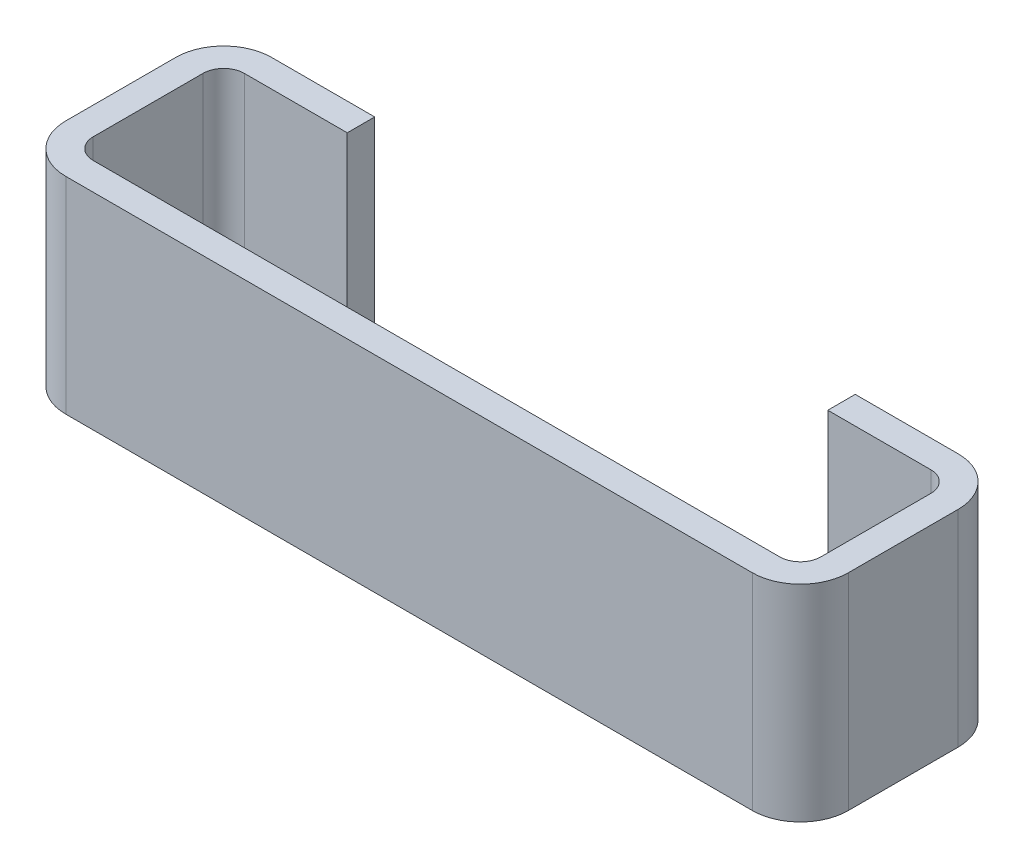
ISO-10303-21;
HEADER;
FILE_DESCRIPTION(('STEP AP214'),'2;1');
FILE_NAME('part.step','',(''),(''),'','','');
FILE_SCHEMA(('AUTOMOTIVE_DESIGN { 1 0 10303 214 1 1 1 1 }'));
ENDSEC;
DATA;
#1=APPLICATION_CONTEXT('core data for automotive mechanical design processes');
#2=APPLICATION_PROTOCOL_DEFINITION('international standard','automotive_design',2000,#1);
#3=PRODUCT_CONTEXT('',#1,'mechanical');
#4=PRODUCT('Part','Part','',(#3));
#5=PRODUCT_RELATED_PRODUCT_CATEGORY('part','',(#4));
#6=PRODUCT_DEFINITION_FORMATION('','',#4);
#7=PRODUCT_DEFINITION_CONTEXT('part definition',#1,'design');
#8=PRODUCT_DEFINITION('design','',#6,#7);
#9=PRODUCT_DEFINITION_SHAPE('','',#8);
#10=(LENGTH_UNIT() NAMED_UNIT(*) SI_UNIT(.MILLI.,.METRE.));
#11=(NAMED_UNIT(*) PLANE_ANGLE_UNIT() SI_UNIT($,.RADIAN.));
#12=(NAMED_UNIT(*) SI_UNIT($,.STERADIAN.) SOLID_ANGLE_UNIT());
#13=UNCERTAINTY_MEASURE_WITH_UNIT(LENGTH_MEASURE(1.E-05),#10,'distance_accuracy_value','');
#14=(GEOMETRIC_REPRESENTATION_CONTEXT(3) GLOBAL_UNCERTAINTY_ASSIGNED_CONTEXT((#13)) GLOBAL_UNIT_ASSIGNED_CONTEXT((#10,
#11,#12)) REPRESENTATION_CONTEXT('',''));
#15=CARTESIAN_POINT('',(0.,0.,0.));
#16=DIRECTION('',(0.,0.,1.));
#17=DIRECTION('',(1.,0.,0.));
#18=AXIS2_PLACEMENT_3D('',#15,#16,#17);
#19=CARTESIAN_POINT('',(1.75,-0.751,0.201));
#20=DIRECTION('',(-1.,0.,0.));
#21=DIRECTION('',(0.,1.,0.));
#22=AXIS2_PLACEMENT_3D('',#19,#20,#21);
#23=PLANE('',#22);
#24=DIRECTION('',(0.,1.,0.));
#25=VECTOR('',#24,1.);
#26=CARTESIAN_POINT('',(1.75,0.,0.));
#27=LINE('',#26,#25);
#28=CARTESIAN_POINT('',(1.75,-0.75,0.));
#29=VERTEX_POINT('',#28);
#30=CARTESIAN_POINT('',(1.75,0.75,0.));
#31=VERTEX_POINT('',#30);
#32=EDGE_CURVE('E162',#29,#31,#27,.T.);
#33=ORIENTED_EDGE('',*,*,#32,.F.);
#34=DIRECTION('',(0.,0.,1.));
#35=VECTOR('',#34,1.);
#36=CARTESIAN_POINT('',(1.75,-0.75,0.0999999999999995));
#37=LINE('',#36,#35);
#38=CARTESIAN_POINT('',(1.75,-0.75,0.2));
#39=VERTEX_POINT('',#38);
#40=EDGE_CURVE('E154',#29,#39,#37,.T.);
#41=ORIENTED_EDGE('',*,*,#40,.T.);
#42=DIRECTION('',(0.,-1.,0.));
#43=VECTOR('',#42,1.);
#44=CARTESIAN_POINT('',(1.75,0.,0.2));
#45=LINE('',#44,#43);
#46=CARTESIAN_POINT('',(1.75,0.75,0.2));
#47=VERTEX_POINT('',#46);
#48=EDGE_CURVE('E178',#47,#39,#45,.T.);
#49=ORIENTED_EDGE('',*,*,#48,.F.);
#50=DIRECTION('',(0.,0.,-1.));
#51=VECTOR('',#50,1.);
#52=CARTESIAN_POINT('',(1.75,0.75,0.0999999999999995));
#53=LINE('',#52,#51);
#54=EDGE_CURVE('E140',#47,#31,#53,.T.);
#55=ORIENTED_EDGE('',*,*,#54,.T.);
#56=EDGE_LOOP('',(#33,#41,#49,#55));
#57=FACE_BOUND('',#56,.T.);
#58=ADVANCED_FACE('F16',(#57),#23,.T.);
#59=CARTESIAN_POINT('',(2.501,-0.751,0.));
#60=DIRECTION('',(0.,0.,-1.));
#61=DIRECTION('',(-1.,0.,0.));
#62=AXIS2_PLACEMENT_3D('',#59,#60,#61);
#63=PLANE('',#62);
#64=DIRECTION('',(1.,0.,0.));
#65=VECTOR('',#64,1.);
#66=CARTESIAN_POINT('',(2.125,0.75,0.));
#67=LINE('',#66,#65);
#68=CARTESIAN_POINT('',(2.5,0.75,0.));
#69=VERTEX_POINT('',#68);
#70=EDGE_CURVE('E135',#31,#69,#67,.T.);
#71=ORIENTED_EDGE('',*,*,#70,.T.);
#72=DIRECTION('',(0.,1.,0.));
#73=VECTOR('',#72,1.);
#74=CARTESIAN_POINT('',(2.5,0.,0.));
#75=LINE('',#74,#73);
#76=CARTESIAN_POINT('',(2.5,-0.75,0.));
#77=VERTEX_POINT('',#76);
#78=EDGE_CURVE('E166',#77,#69,#75,.T.);
#79=ORIENTED_EDGE('',*,*,#78,.F.);
#80=DIRECTION('',(-1.,0.,0.));
#81=VECTOR('',#80,1.);
#82=CARTESIAN_POINT('',(2.125,-0.75,0.));
#83=LINE('',#82,#81);
#84=EDGE_CURVE('E158',#77,#29,#83,.T.);
#85=ORIENTED_EDGE('',*,*,#84,.T.);
#86=ORIENTED_EDGE('',*,*,#32,.T.);
#87=EDGE_LOOP('',(#71,#79,#85,#86));
#88=FACE_BOUND('',#87,.T.);
#89=ADVANCED_FACE('F164',(#88),#63,.T.);
#90=CARTESIAN_POINT('',(1.749,-0.751,0.2));
#91=DIRECTION('',(0.,0.,1.));
#92=DIRECTION('',(1.,0.,0.));
#93=AXIS2_PLACEMENT_3D('',#90,#91,#92);
#94=PLANE('',#93);
#95=DIRECTION('',(-1.,0.,0.));
#96=VECTOR('',#95,1.);
#97=CARTESIAN_POINT('',(2.125,0.75,0.2));
#98=LINE('',#97,#96);
#99=CARTESIAN_POINT('',(2.5,0.75,0.2));
#100=VERTEX_POINT('',#99);
#101=EDGE_CURVE('E181',#100,#47,#98,.T.);
#102=ORIENTED_EDGE('',*,*,#101,.T.);
#103=ORIENTED_EDGE('',*,*,#48,.T.);
#104=DIRECTION('',(1.,0.,0.));
#105=VECTOR('',#104,1.);
#106=CARTESIAN_POINT('',(2.125,-0.75,0.2));
#107=LINE('',#106,#105);
#108=CARTESIAN_POINT('',(2.5,-0.75,0.2));
#109=VERTEX_POINT('',#108);
#110=EDGE_CURVE('E148',#39,#109,#107,.T.);
#111=ORIENTED_EDGE('',*,*,#110,.T.);
#112=DIRECTION('',(0.,-1.,0.));
#113=VECTOR('',#112,1.);
#114=CARTESIAN_POINT('',(2.5,0.,0.2));
#115=LINE('',#114,#113);
#116=EDGE_CURVE('E231',#100,#109,#115,.T.);
#117=ORIENTED_EDGE('',*,*,#116,.F.);
#118=EDGE_LOOP('',(#102,#103,#111,#117));
#119=FACE_BOUND('',#118,.T.);
#120=ADVANCED_FACE('F253',(#119),#94,.T.);
#121=CARTESIAN_POINT('',(-2.501,-0.751,0.2));
#122=DIRECTION('',(0.,0.,1.));
#123=DIRECTION('',(1.,0.,0.));
#124=AXIS2_PLACEMENT_3D('',#121,#122,#123);
#125=PLANE('',#124);
#126=DIRECTION('',(-1.,0.,0.));
#127=VECTOR('',#126,1.);
#128=CARTESIAN_POINT('',(-2.125,0.75,0.2));
#129=LINE('',#128,#127);
#130=CARTESIAN_POINT('',(-1.75,0.75,0.2));
#131=VERTEX_POINT('',#130);
#132=CARTESIAN_POINT('',(-2.5,0.75,0.2));
#133=VERTEX_POINT('',#132);
#134=EDGE_CURVE('E180',#131,#133,#129,.T.);
#135=ORIENTED_EDGE('',*,*,#134,.T.);
#136=DIRECTION('',(0.,1.,0.));
#137=VECTOR('',#136,1.);
#138=CARTESIAN_POINT('',(-2.5,0.,0.2));
#139=LINE('',#138,#137);
#140=CARTESIAN_POINT('',(-2.5,-0.75,0.2));
#141=VERTEX_POINT('',#140);
#142=EDGE_CURVE('E207',#141,#133,#139,.T.);
#143=ORIENTED_EDGE('',*,*,#142,.F.);
#144=DIRECTION('',(-1.,0.,0.));
#145=VECTOR('',#144,1.);
#146=CARTESIAN_POINT('',(0.,-0.75,0.2));
#147=LINE('',#146,#145);
#148=CARTESIAN_POINT('',(-1.75,-0.75,0.2));
#149=VERTEX_POINT('',#148);
#150=EDGE_CURVE('E340',#149,#141,#147,.T.);
#151=ORIENTED_EDGE('',*,*,#150,.F.);
#152=DIRECTION('',(0.,-1.,0.));
#153=VECTOR('',#152,1.);
#154=CARTESIAN_POINT('',(-1.75,0.,0.2));
#155=LINE('',#154,#153);
#156=EDGE_CURVE('E330',#131,#149,#155,.T.);
#157=ORIENTED_EDGE('',*,*,#156,.F.);
#158=EDGE_LOOP('',(#135,#143,#151,#157));
#159=FACE_BOUND('',#158,.T.);
#160=ADVANCED_FACE('F367',(#159),#125,.T.);
#161=CARTESIAN_POINT('',(2.5,0.75,0.35));
#162=DIRECTION('',(0.,-1.,0.));
#163=DIRECTION('',(0.,0.,-1.));
#164=AXIS2_PLACEMENT_3D('',#161,#162,#163);
#165=CYLINDRICAL_SURFACE('',#164,0.35);
#166=CARTESIAN_POINT('',(2.5,0.75,0.35));
#167=DIRECTION('',(0.,-1.,0.));
#168=DIRECTION('',(0.,0.,-1.));
#169=AXIS2_PLACEMENT_3D('',#166,#167,#168);
#170=CIRCLE('',#169,0.35);
#171=CARTESIAN_POINT('',(2.85,0.75,0.35));
#172=VERTEX_POINT('',#171);
#173=EDGE_CURVE('E20',#69,#172,#170,.T.);
#174=ORIENTED_EDGE('',*,*,#173,.T.);
#175=DIRECTION('',(0.,1.,0.));
#176=VECTOR('',#175,1.);
#177=CARTESIAN_POINT('',(2.85,0.,0.35));
#178=LINE('',#177,#176);
#179=CARTESIAN_POINT('',(2.85,-0.75,0.35));
#180=VERTEX_POINT('',#179);
#181=EDGE_CURVE('E314',#180,#172,#178,.T.);
#182=ORIENTED_EDGE('',*,*,#181,.F.);
#183=CARTESIAN_POINT('',(2.5,-0.75,0.35));
#184=DIRECTION('',(0.,-1.,0.));
#185=DIRECTION('',(0.,0.,-1.));
#186=AXIS2_PLACEMENT_3D('',#183,#184,#185);
#187=CIRCLE('',#186,0.35);
#188=EDGE_CURVE('E229',#77,#180,#187,.T.);
#189=ORIENTED_EDGE('',*,*,#188,.F.);
#190=ORIENTED_EDGE('',*,*,#78,.T.);
#191=EDGE_LOOP('',(#174,#182,#189,#190));
#192=FACE_BOUND('',#191,.T.);
#193=ADVANCED_FACE('F401',(#192),#165,.T.);
#194=CARTESIAN_POINT('',(2.5,0.75,1.15));
#195=DIRECTION('',(0.,-1.,0.));
#196=DIRECTION('',(0.,0.,-1.));
#197=AXIS2_PLACEMENT_3D('',#194,#195,#196);
#198=CYLINDRICAL_SURFACE('',#197,0.35);
#199=CARTESIAN_POINT('',(2.5,0.75,1.15));
#200=DIRECTION('',(0.,-1.,0.));
#201=DIRECTION('',(0.,0.,-1.));
#202=AXIS2_PLACEMENT_3D('',#199,#200,#201);
#203=CIRCLE('',#202,0.35);
#204=CARTESIAN_POINT('',(2.85,0.75,1.15));
#205=VERTEX_POINT('',#204);
#206=CARTESIAN_POINT('',(2.5,0.75,1.5));
#207=VERTEX_POINT('',#206);
#208=EDGE_CURVE('E234',#205,#207,#203,.T.);
#209=ORIENTED_EDGE('',*,*,#208,.T.);
#210=DIRECTION('',(0.,1.,0.));
#211=VECTOR('',#210,1.);
#212=CARTESIAN_POINT('',(2.5,0.,1.5));
#213=LINE('',#212,#211);
#214=CARTESIAN_POINT('',(2.5,-0.75,1.5));
#215=VERTEX_POINT('',#214);
#216=EDGE_CURVE('E317',#215,#207,#213,.T.);
#217=ORIENTED_EDGE('',*,*,#216,.F.);
#218=CARTESIAN_POINT('',(2.5,-0.75,1.15));
#219=DIRECTION('',(0.,-1.,0.));
#220=DIRECTION('',(0.,0.,-1.));
#221=AXIS2_PLACEMENT_3D('',#218,#219,#220);
#222=CIRCLE('',#221,0.35);
#223=CARTESIAN_POINT('',(2.85,-0.75,1.15));
#224=VERTEX_POINT('',#223);
#225=EDGE_CURVE('E227',#224,#215,#222,.T.);
#226=ORIENTED_EDGE('',*,*,#225,.F.);
#227=DIRECTION('',(0.,-1.,0.));
#228=VECTOR('',#227,1.);
#229=CARTESIAN_POINT('',(2.85,0.,1.15));
#230=LINE('',#229,#228);
#231=EDGE_CURVE('E311',#205,#224,#230,.T.);
#232=ORIENTED_EDGE('',*,*,#231,.F.);
#233=EDGE_LOOP('',(#209,#217,#226,#232));
#234=FACE_BOUND('',#233,.T.);
#235=ADVANCED_FACE('F396',(#234),#198,.T.);
#236=CARTESIAN_POINT('',(2.5,-0.75,0.35));
#237=DIRECTION('',(0.,1.,0.));
#238=DIRECTION('',(0.,0.,1.));
#239=AXIS2_PLACEMENT_3D('',#236,#237,#238);
#240=CYLINDRICAL_SURFACE('',#239,0.15);
#241=CARTESIAN_POINT('',(2.5,0.75,0.35));
#242=DIRECTION('',(0.,1.,0.));
#243=DIRECTION('',(0.,0.,1.));
#244=AXIS2_PLACEMENT_3D('',#241,#242,#243);
#245=CIRCLE('',#244,0.15);
#246=CARTESIAN_POINT('',(2.65,0.75,0.35));
#247=VERTEX_POINT('',#246);
#248=EDGE_CURVE('E232',#247,#100,#245,.T.);
#249=ORIENTED_EDGE('',*,*,#248,.T.);
#250=ORIENTED_EDGE('',*,*,#116,.T.);
#251=CARTESIAN_POINT('',(2.5,-0.75,0.35));
#252=DIRECTION('',(0.,1.,0.));
#253=DIRECTION('',(0.,0.,1.));
#254=AXIS2_PLACEMENT_3D('',#251,#252,#253);
#255=CIRCLE('',#254,0.15);
#256=CARTESIAN_POINT('',(2.65,-0.75,0.35));
#257=VERTEX_POINT('',#256);
#258=EDGE_CURVE('E216',#257,#109,#255,.T.);
#259=ORIENTED_EDGE('',*,*,#258,.F.);
#260=DIRECTION('',(0.,-1.,0.));
#261=VECTOR('',#260,1.);
#262=CARTESIAN_POINT('',(2.65,0.,0.35));
#263=LINE('',#262,#261);
#264=EDGE_CURVE('E263',#247,#257,#263,.T.);
#265=ORIENTED_EDGE('',*,*,#264,.F.);
#266=EDGE_LOOP('',(#249,#250,#259,#265));
#267=FACE_BOUND('',#266,.T.);
#268=ADVANCED_FACE('F264',(#267),#240,.F.);
#269=CARTESIAN_POINT('',(2.851,-0.75,1.501));
#270=DIRECTION('',(0.,-1.,0.));
#271=DIRECTION('',(-1.,0.,0.));
#272=AXIS2_PLACEMENT_3D('',#269,#270,#271);
#273=PLANE('',#272);
#274=ORIENTED_EDGE('',*,*,#110,.F.);
#275=ORIENTED_EDGE('',*,*,#40,.F.);
#276=ORIENTED_EDGE('',*,*,#84,.F.);
#277=ORIENTED_EDGE('',*,*,#188,.T.);
#278=DIRECTION('',(0.,0.,-1.));
#279=VECTOR('',#278,1.);
#280=CARTESIAN_POINT('',(2.85,-0.75,0.75));
#281=LINE('',#280,#279);
#282=EDGE_CURVE('E316',#224,#180,#281,.T.);
#283=ORIENTED_EDGE('',*,*,#282,.F.);
#284=ORIENTED_EDGE('',*,*,#225,.T.);
#285=DIRECTION('',(1.,0.,0.));
#286=VECTOR('',#285,1.);
#287=CARTESIAN_POINT('',(0.,-0.75,1.5));
#288=LINE('',#287,#286);
#289=CARTESIAN_POINT('',(-2.5,-0.75,1.5));
#290=VERTEX_POINT('',#289);
#291=EDGE_CURVE('E319',#290,#215,#288,.T.);
#292=ORIENTED_EDGE('',*,*,#291,.F.);
#293=CARTESIAN_POINT('',(-2.5,-0.75,1.15));
#294=DIRECTION('',(0.,-1.,0.));
#295=DIRECTION('',(0.,0.,-1.));
#296=AXIS2_PLACEMENT_3D('',#293,#294,#295);
#297=CIRCLE('',#296,0.35);
#298=CARTESIAN_POINT('',(-2.85,-0.75,1.15));
#299=VERTEX_POINT('',#298);
#300=EDGE_CURVE('E224',#290,#299,#297,.T.);
#301=ORIENTED_EDGE('',*,*,#300,.T.);
#302=DIRECTION('',(0.,0.,-1.));
#303=VECTOR('',#302,1.);
#304=CARTESIAN_POINT('',(-2.85,-0.75,0.749999999999999));
#305=LINE('',#304,#303);
#306=CARTESIAN_POINT('',(-2.85,-0.75,0.35));
#307=VERTEX_POINT('',#306);
#308=EDGE_CURVE('E223',#299,#307,#305,.T.);
#309=ORIENTED_EDGE('',*,*,#308,.T.);
#310=CARTESIAN_POINT('',(-2.5,-0.75,0.35));
#311=DIRECTION('',(0.,-1.,0.));
#312=DIRECTION('',(0.,0.,-1.));
#313=AXIS2_PLACEMENT_3D('',#310,#311,#312);
#314=CIRCLE('',#313,0.35);
#315=CARTESIAN_POINT('',(-2.5,-0.75,0.));
#316=VERTEX_POINT('',#315);
#317=EDGE_CURVE('E219',#307,#316,#314,.T.);
#318=ORIENTED_EDGE('',*,*,#317,.T.);
#319=DIRECTION('',(1.,0.,0.));
#320=VECTOR('',#319,1.);
#321=CARTESIAN_POINT('',(0.,-0.75,0.));
#322=LINE('',#321,#320);
#323=CARTESIAN_POINT('',(-1.75,-0.75,0.));
#324=VERTEX_POINT('',#323);
#325=EDGE_CURVE('E222',#316,#324,#322,.T.);
#326=ORIENTED_EDGE('',*,*,#325,.T.);
#327=DIRECTION('',(0.,0.,-1.));
#328=VECTOR('',#327,1.);
#329=CARTESIAN_POINT('',(-1.75,-0.75,0.0999999999999995));
#330=LINE('',#329,#328);
#331=EDGE_CURVE('E327',#149,#324,#330,.T.);
#332=ORIENTED_EDGE('',*,*,#331,.F.);
#333=ORIENTED_EDGE('',*,*,#150,.T.);
#334=CARTESIAN_POINT('',(-2.5,-0.75,0.35));
#335=DIRECTION('',(0.,1.,0.));
#336=DIRECTION('',(0.,0.,1.));
#337=AXIS2_PLACEMENT_3D('',#334,#335,#336);
#338=CIRCLE('',#337,0.15);
#339=CARTESIAN_POINT('',(-2.65,-0.75,0.35));
#340=VERTEX_POINT('',#339);
#341=EDGE_CURVE('E208',#340,#141,#338,.F.);
#342=ORIENTED_EDGE('',*,*,#341,.F.);
#343=DIRECTION('',(0.,0.,1.));
#344=VECTOR('',#343,1.);
#345=CARTESIAN_POINT('',(-2.65,-0.75,0.75));
#346=LINE('',#345,#344);
#347=CARTESIAN_POINT('',(-2.65,-0.75,1.15));
#348=VERTEX_POINT('',#347);
#349=EDGE_CURVE('E218',#340,#348,#346,.T.);
#350=ORIENTED_EDGE('',*,*,#349,.T.);
#351=CARTESIAN_POINT('',(-2.5,-0.75,1.15));
#352=DIRECTION('',(0.,1.,0.));
#353=DIRECTION('',(0.,0.,1.));
#354=AXIS2_PLACEMENT_3D('',#351,#352,#353);
#355=CIRCLE('',#354,0.15);
#356=CARTESIAN_POINT('',(-2.5,-0.75,1.3));
#357=VERTEX_POINT('',#356);
#358=EDGE_CURVE('E202',#357,#348,#355,.F.);
#359=ORIENTED_EDGE('',*,*,#358,.F.);
#360=DIRECTION('',(-1.,0.,0.));
#361=VECTOR('',#360,1.);
#362=CARTESIAN_POINT('',(0.,-0.75,1.3));
#363=LINE('',#362,#361);
#364=CARTESIAN_POINT('',(2.5,-0.75,1.3));
#365=VERTEX_POINT('',#364);
#366=EDGE_CURVE('E268',#365,#357,#363,.T.);
#367=ORIENTED_EDGE('',*,*,#366,.F.);
#368=CARTESIAN_POINT('',(2.5,-0.75,1.15));
#369=DIRECTION('',(0.,1.,0.));
#370=DIRECTION('',(0.,0.,1.));
#371=AXIS2_PLACEMENT_3D('',#368,#369,#370);
#372=CIRCLE('',#371,0.15);
#373=CARTESIAN_POINT('',(2.65,-0.75,1.15));
#374=VERTEX_POINT('',#373);
#375=EDGE_CURVE('E213',#374,#365,#372,.F.);
#376=ORIENTED_EDGE('',*,*,#375,.F.);
#377=DIRECTION('',(0.,0.,1.));
#378=VECTOR('',#377,1.);
#379=CARTESIAN_POINT('',(2.65,-0.75,0.75));
#380=LINE('',#379,#378);
#381=EDGE_CURVE('E310',#257,#374,#380,.T.);
#382=ORIENTED_EDGE('',*,*,#381,.F.);
#383=ORIENTED_EDGE('',*,*,#258,.T.);
#384=EDGE_LOOP('',(#274,#275,#276,#277,#283,#284,#292,#301,#309,#318,#326,#332,#333,#342,#350,
#359,#367,#376,#382,#383));
#385=FACE_BOUND('',#384,.T.);
#386=ADVANCED_FACE('F156',(#385),#273,.T.);
#387=CARTESIAN_POINT('',(2.5,-0.75,1.15));
#388=DIRECTION('',(0.,1.,0.));
#389=DIRECTION('',(0.,0.,1.));
#390=AXIS2_PLACEMENT_3D('',#387,#388,#389);
#391=CYLINDRICAL_SURFACE('',#390,0.15);
#392=CARTESIAN_POINT('',(2.5,0.75,1.15));
#393=DIRECTION('',(0.,1.,0.));
#394=DIRECTION('',(0.,0.,1.));
#395=AXIS2_PLACEMENT_3D('',#392,#393,#394);
#396=CIRCLE('',#395,0.15);
#397=CARTESIAN_POINT('',(2.5,0.75,1.3));
#398=VERTEX_POINT('',#397);
#399=CARTESIAN_POINT('',(2.65,0.75,1.15));
#400=VERTEX_POINT('',#399);
#401=EDGE_CURVE('E211',#398,#400,#396,.T.);
#402=ORIENTED_EDGE('',*,*,#401,.T.);
#403=DIRECTION('',(0.,1.,0.));
#404=VECTOR('',#403,1.);
#405=CARTESIAN_POINT('',(2.65,0.,1.15));
#406=LINE('',#405,#404);
#407=EDGE_CURVE('E269',#374,#400,#406,.T.);
#408=ORIENTED_EDGE('',*,*,#407,.F.);
#409=ORIENTED_EDGE('',*,*,#375,.T.);
#410=DIRECTION('',(0.,-1.,0.));
#411=VECTOR('',#410,1.);
#412=CARTESIAN_POINT('',(2.5,0.,1.3));
#413=LINE('',#412,#411);
#414=EDGE_CURVE('E303',#398,#365,#413,.T.);
#415=ORIENTED_EDGE('',*,*,#414,.F.);
#416=EDGE_LOOP('',(#402,#408,#409,#415));
#417=FACE_BOUND('',#416,.T.);
#418=ADVANCED_FACE('F444',(#417),#391,.F.);
#419=CARTESIAN_POINT('',(-2.5,-0.75,0.35));
#420=DIRECTION('',(0.,1.,0.));
#421=DIRECTION('',(0.,0.,1.));
#422=AXIS2_PLACEMENT_3D('',#419,#420,#421);
#423=CYLINDRICAL_SURFACE('',#422,0.15);
#424=CARTESIAN_POINT('',(-2.5,0.75,0.35));
#425=DIRECTION('',(0.,1.,0.));
#426=DIRECTION('',(0.,0.,1.));
#427=AXIS2_PLACEMENT_3D('',#424,#425,#426);
#428=CIRCLE('',#427,0.15);
#429=CARTESIAN_POINT('',(-2.65,0.75,0.35));
#430=VERTEX_POINT('',#429);
#431=EDGE_CURVE('E205',#133,#430,#428,.T.);
#432=ORIENTED_EDGE('',*,*,#431,.T.);
#433=DIRECTION('',(0.,1.,0.));
#434=VECTOR('',#433,1.);
#435=CARTESIAN_POINT('',(-2.65,0.,0.35));
#436=LINE('',#435,#434);
#437=EDGE_CURVE('E300',#340,#430,#436,.T.);
#438=ORIENTED_EDGE('',*,*,#437,.F.);
#439=ORIENTED_EDGE('',*,*,#341,.T.);
#440=ORIENTED_EDGE('',*,*,#142,.T.);
#441=EDGE_LOOP('',(#432,#438,#439,#440));
#442=FACE_BOUND('',#441,.T.);
#443=ADVANCED_FACE('F361',(#442),#423,.F.);
#444=CARTESIAN_POINT('',(-2.5,-0.75,1.15));
#445=DIRECTION('',(0.,1.,0.));
#446=DIRECTION('',(0.,0.,1.));
#447=AXIS2_PLACEMENT_3D('',#444,#445,#446);
#448=CYLINDRICAL_SURFACE('',#447,0.15);
#449=CARTESIAN_POINT('',(-2.5,0.75,1.15));
#450=DIRECTION('',(0.,1.,0.));
#451=DIRECTION('',(0.,0.,1.));
#452=AXIS2_PLACEMENT_3D('',#449,#450,#451);
#453=CIRCLE('',#452,0.15);
#454=CARTESIAN_POINT('',(-2.65,0.75,1.15));
#455=VERTEX_POINT('',#454);
#456=CARTESIAN_POINT('',(-2.5,0.75,1.3));
#457=VERTEX_POINT('',#456);
#458=EDGE_CURVE('E199',#455,#457,#453,.T.);
#459=ORIENTED_EDGE('',*,*,#458,.T.);
#460=DIRECTION('',(0.,1.,0.));
#461=VECTOR('',#460,1.);
#462=CARTESIAN_POINT('',(-2.5,0.,1.3));
#463=LINE('',#462,#461);
#464=EDGE_CURVE('E306',#357,#457,#463,.T.);
#465=ORIENTED_EDGE('',*,*,#464,.F.);
#466=ORIENTED_EDGE('',*,*,#358,.T.);
#467=DIRECTION('',(0.,-1.,0.));
#468=VECTOR('',#467,1.);
#469=CARTESIAN_POINT('',(-2.65,0.,1.15));
#470=LINE('',#469,#468);
#471=EDGE_CURVE('E296',#455,#348,#470,.T.);
#472=ORIENTED_EDGE('',*,*,#471,.F.);
#473=EDGE_LOOP('',(#459,#465,#466,#472));
#474=FACE_BOUND('',#473,.T.);
#475=ADVANCED_FACE('F438',(#474),#448,.F.);
#476=CARTESIAN_POINT('',(-1.75,0.751,0.201));
#477=DIRECTION('',(1.,0.,0.));
#478=DIRECTION('',(0.,-1.,0.));
#479=AXIS2_PLACEMENT_3D('',#476,#477,#478);
#480=PLANE('',#479);
#481=ORIENTED_EDGE('',*,*,#331,.T.);
#482=DIRECTION('',(0.,-1.,0.));
#483=VECTOR('',#482,1.);
#484=CARTESIAN_POINT('',(-1.75,0.,0.));
#485=LINE('',#484,#483);
#486=CARTESIAN_POINT('',(-1.75,0.75,0.));
#487=VERTEX_POINT('',#486);
#488=EDGE_CURVE('E299',#487,#324,#485,.T.);
#489=ORIENTED_EDGE('',*,*,#488,.F.);
#490=DIRECTION('',(0.,0.,1.));
#491=VECTOR('',#490,1.);
#492=CARTESIAN_POINT('',(-1.75,0.75,0.0999999999999995));
#493=LINE('',#492,#491);
#494=EDGE_CURVE('E201',#487,#131,#493,.T.);
#495=ORIENTED_EDGE('',*,*,#494,.T.);
#496=ORIENTED_EDGE('',*,*,#156,.T.);
#497=EDGE_LOOP('',(#481,#489,#495,#496));
#498=FACE_BOUND('',#497,.T.);
#499=ADVANCED_FACE('F379',(#498),#480,.T.);
#500=CARTESIAN_POINT('',(-2.501,-0.751,1.5));
#501=DIRECTION('',(0.,0.,1.));
#502=DIRECTION('',(1.,0.,0.));
#503=AXIS2_PLACEMENT_3D('',#500,#501,#502);
#504=PLANE('',#503);
#505=DIRECTION('',(1.,0.,0.));
#506=VECTOR('',#505,1.);
#507=CARTESIAN_POINT('',(0.,0.75,1.5));
#508=LINE('',#507,#506);
#509=CARTESIAN_POINT('',(-2.5,0.75,1.5));
#510=VERTEX_POINT('',#509);
#511=EDGE_CURVE('E197',#510,#207,#508,.T.);
#512=ORIENTED_EDGE('',*,*,#511,.F.);
#513=DIRECTION('',(0.,1.,0.));
#514=VECTOR('',#513,1.);
#515=CARTESIAN_POINT('',(-2.5,0.,1.5));
#516=LINE('',#515,#514);
#517=EDGE_CURVE('E286',#290,#510,#516,.T.);
#518=ORIENTED_EDGE('',*,*,#517,.F.);
#519=ORIENTED_EDGE('',*,*,#291,.T.);
#520=ORIENTED_EDGE('',*,*,#216,.T.);
#521=EDGE_LOOP('',(#512,#518,#519,#520));
#522=FACE_BOUND('',#521,.T.);
#523=ADVANCED_FACE('F395',(#522),#504,.T.);
#524=CARTESIAN_POINT('',(2.85,-0.751,1.151));
#525=DIRECTION('',(1.,0.,0.));
#526=DIRECTION('',(0.,0.,-1.));
#527=AXIS2_PLACEMENT_3D('',#524,#525,#526);
#528=PLANE('',#527);
#529=DIRECTION('',(0.,0.,-1.));
#530=VECTOR('',#529,1.);
#531=CARTESIAN_POINT('',(2.85,0.75,0.75));
#532=LINE('',#531,#530);
#533=EDGE_CURVE('E275',#205,#172,#532,.T.);
#534=ORIENTED_EDGE('',*,*,#533,.F.);
#535=ORIENTED_EDGE('',*,*,#231,.T.);
#536=ORIENTED_EDGE('',*,*,#282,.T.);
#537=ORIENTED_EDGE('',*,*,#181,.T.);
#538=EDGE_LOOP('',(#534,#535,#536,#537));
#539=FACE_BOUND('',#538,.T.);
#540=ADVANCED_FACE('F400',(#539),#528,.T.);
#541=CARTESIAN_POINT('',(2.65,-0.751,0.349));
#542=DIRECTION('',(-1.,0.,0.));
#543=DIRECTION('',(0.,0.,1.));
#544=AXIS2_PLACEMENT_3D('',#541,#542,#543);
#545=PLANE('',#544);
#546=DIRECTION('',(0.,0.,1.));
#547=VECTOR('',#546,1.);
#548=CARTESIAN_POINT('',(2.65,0.75,0.75));
#549=LINE('',#548,#547);
#550=EDGE_CURVE('E260',#247,#400,#549,.T.);
#551=ORIENTED_EDGE('',*,*,#550,.F.);
#552=ORIENTED_EDGE('',*,*,#264,.T.);
#553=ORIENTED_EDGE('',*,*,#381,.T.);
#554=ORIENTED_EDGE('',*,*,#407,.T.);
#555=EDGE_LOOP('',(#551,#552,#553,#554));
#556=FACE_BOUND('',#555,.T.);
#557=ADVANCED_FACE('F272',(#556),#545,.T.);
#558=CARTESIAN_POINT('',(2.501,-0.751,1.3));
#559=DIRECTION('',(0.,0.,-1.));
#560=DIRECTION('',(-1.,0.,0.));
#561=AXIS2_PLACEMENT_3D('',#558,#559,#560);
#562=PLANE('',#561);
#563=DIRECTION('',(-1.,0.,0.));
#564=VECTOR('',#563,1.);
#565=CARTESIAN_POINT('',(0.,0.75,1.3));
#566=LINE('',#565,#564);
#567=EDGE_CURVE('E274',#398,#457,#566,.T.);
#568=ORIENTED_EDGE('',*,*,#567,.F.);
#569=ORIENTED_EDGE('',*,*,#414,.T.);
#570=ORIENTED_EDGE('',*,*,#366,.T.);
#571=ORIENTED_EDGE('',*,*,#464,.T.);
#572=EDGE_LOOP('',(#568,#569,#570,#571));
#573=FACE_BOUND('',#572,.T.);
#574=ADVANCED_FACE('F426',(#573),#562,.T.);
#575=CARTESIAN_POINT('',(-2.65,-0.751,1.151));
#576=DIRECTION('',(1.,0.,0.));
#577=DIRECTION('',(0.,0.,-1.));
#578=AXIS2_PLACEMENT_3D('',#575,#576,#577);
#579=PLANE('',#578);
#580=DIRECTION('',(0.,0.,-1.));
#581=VECTOR('',#580,1.);
#582=CARTESIAN_POINT('',(-2.65,0.75,0.749999999999999));
#583=LINE('',#582,#581);
#584=EDGE_CURVE('E193',#455,#430,#583,.T.);
#585=ORIENTED_EDGE('',*,*,#584,.F.);
#586=ORIENTED_EDGE('',*,*,#471,.T.);
#587=ORIENTED_EDGE('',*,*,#349,.F.);
#588=ORIENTED_EDGE('',*,*,#437,.T.);
#589=EDGE_LOOP('',(#585,#586,#587,#588));
#590=FACE_BOUND('',#589,.T.);
#591=ADVANCED_FACE('F375',(#590),#579,.T.);
#592=CARTESIAN_POINT('',(-1.749,-0.751,0.));
#593=DIRECTION('',(0.,0.,-1.));
#594=DIRECTION('',(-1.,0.,0.));
#595=AXIS2_PLACEMENT_3D('',#592,#593,#594);
#596=PLANE('',#595);
#597=DIRECTION('',(-1.,0.,0.));
#598=VECTOR('',#597,1.);
#599=CARTESIAN_POINT('',(0.,0.75,0.));
#600=LINE('',#599,#598);
#601=CARTESIAN_POINT('',(-2.5,0.75,0.));
#602=VERTEX_POINT('',#601);
#603=EDGE_CURVE('E198',#487,#602,#600,.T.);
#604=ORIENTED_EDGE('',*,*,#603,.F.);
#605=ORIENTED_EDGE('',*,*,#488,.T.);
#606=ORIENTED_EDGE('',*,*,#325,.F.);
#607=DIRECTION('',(0.,-1.,0.));
#608=VECTOR('',#607,1.);
#609=CARTESIAN_POINT('',(-2.5,0.,0.));
#610=LINE('',#609,#608);
#611=EDGE_CURVE('E192',#602,#316,#610,.T.);
#612=ORIENTED_EDGE('',*,*,#611,.F.);
#613=EDGE_LOOP('',(#604,#605,#606,#612));
#614=FACE_BOUND('',#613,.T.);
#615=ADVANCED_FACE('F384',(#614),#596,.T.);
#616=CARTESIAN_POINT('',(-2.5,0.75,1.15));
#617=DIRECTION('',(0.,-1.,0.));
#618=DIRECTION('',(0.,0.,-1.));
#619=AXIS2_PLACEMENT_3D('',#616,#617,#618);
#620=CYLINDRICAL_SURFACE('',#619,0.35);
#621=CARTESIAN_POINT('',(-2.5,0.75,1.15));
#622=DIRECTION('',(0.,-1.,0.));
#623=DIRECTION('',(0.,0.,-1.));
#624=AXIS2_PLACEMENT_3D('',#621,#622,#623);
#625=CIRCLE('',#624,0.35);
#626=CARTESIAN_POINT('',(-2.85,0.75,1.15));
#627=VERTEX_POINT('',#626);
#628=EDGE_CURVE('E194',#627,#510,#625,.F.);
#629=ORIENTED_EDGE('',*,*,#628,.F.);
#630=DIRECTION('',(0.,1.,0.));
#631=VECTOR('',#630,1.);
#632=CARTESIAN_POINT('',(-2.85,0.,1.15));
#633=LINE('',#632,#631);
#634=EDGE_CURVE('E289',#299,#627,#633,.T.);
#635=ORIENTED_EDGE('',*,*,#634,.F.);
#636=ORIENTED_EDGE('',*,*,#300,.F.);
#637=ORIENTED_EDGE('',*,*,#517,.T.);
#638=EDGE_LOOP('',(#629,#635,#636,#637));
#639=FACE_BOUND('',#638,.T.);
#640=ADVANCED_FACE('F391',(#639),#620,.T.);
#641=CARTESIAN_POINT('',(-2.851,0.75,1.501));
#642=DIRECTION('',(0.,1.,0.));
#643=DIRECTION('',(1.,0.,0.));
#644=AXIS2_PLACEMENT_3D('',#641,#642,#643);
#645=PLANE('',#644);
#646=ORIENTED_EDGE('',*,*,#134,.F.);
#647=ORIENTED_EDGE('',*,*,#494,.F.);
#648=ORIENTED_EDGE('',*,*,#603,.T.);
#649=CARTESIAN_POINT('',(-2.5,0.75,0.35));
#650=DIRECTION('',(0.,-1.,0.));
#651=DIRECTION('',(0.,0.,-1.));
#652=AXIS2_PLACEMENT_3D('',#649,#650,#651);
#653=CIRCLE('',#652,0.35);
#654=CARTESIAN_POINT('',(-2.85,0.75,0.35));
#655=VERTEX_POINT('',#654);
#656=EDGE_CURVE('E35',#655,#602,#653,.T.);
#657=ORIENTED_EDGE('',*,*,#656,.F.);
#658=DIRECTION('',(0.,0.,-1.));
#659=VECTOR('',#658,1.);
#660=CARTESIAN_POINT('',(-2.85,0.75,0.75));
#661=LINE('',#660,#659);
#662=EDGE_CURVE('E26',#627,#655,#661,.T.);
#663=ORIENTED_EDGE('',*,*,#662,.F.);
#664=ORIENTED_EDGE('',*,*,#628,.T.);
#665=ORIENTED_EDGE('',*,*,#511,.T.);
#666=ORIENTED_EDGE('',*,*,#208,.F.);
#667=ORIENTED_EDGE('',*,*,#533,.T.);
#668=ORIENTED_EDGE('',*,*,#173,.F.);
#669=ORIENTED_EDGE('',*,*,#70,.F.);
#670=ORIENTED_EDGE('',*,*,#54,.F.);
#671=ORIENTED_EDGE('',*,*,#101,.F.);
#672=ORIENTED_EDGE('',*,*,#248,.F.);
#673=ORIENTED_EDGE('',*,*,#550,.T.);
#674=ORIENTED_EDGE('',*,*,#401,.F.);
#675=ORIENTED_EDGE('',*,*,#567,.T.);
#676=ORIENTED_EDGE('',*,*,#458,.F.);
#677=ORIENTED_EDGE('',*,*,#584,.T.);
#678=ORIENTED_EDGE('',*,*,#431,.F.);
#679=EDGE_LOOP('',(#646,#647,#648,#657,#663,#664,#665,#666,#667,#668,#669,#670,#671,#672,#673,
#674,#675,#676,#677,#678));
#680=FACE_BOUND('',#679,.T.);
#681=ADVANCED_FACE('F256',(#680),#645,.T.);
#682=CARTESIAN_POINT('',(-2.5,0.75,0.35));
#683=DIRECTION('',(0.,-1.,0.));
#684=DIRECTION('',(0.,0.,-1.));
#685=AXIS2_PLACEMENT_3D('',#682,#683,#684);
#686=CYLINDRICAL_SURFACE('',#685,0.35);
#687=ORIENTED_EDGE('',*,*,#656,.T.);
#688=ORIENTED_EDGE('',*,*,#611,.T.);
#689=ORIENTED_EDGE('',*,*,#317,.F.);
#690=DIRECTION('',(0.,-1.,0.));
#691=VECTOR('',#690,1.);
#692=CARTESIAN_POINT('',(-2.85,0.,0.35));
#693=LINE('',#692,#691);
#694=EDGE_CURVE('E11',#655,#307,#693,.T.);
#695=ORIENTED_EDGE('',*,*,#694,.F.);
#696=EDGE_LOOP('',(#687,#688,#689,#695));
#697=FACE_BOUND('',#696,.T.);
#698=ADVANCED_FACE('F386',(#697),#686,.T.);
#699=CARTESIAN_POINT('',(-2.85,-0.751,0.349));
#700=DIRECTION('',(-1.,0.,0.));
#701=DIRECTION('',(0.,0.,1.));
#702=AXIS2_PLACEMENT_3D('',#699,#700,#701);
#703=PLANE('',#702);
#704=ORIENTED_EDGE('',*,*,#662,.T.);
#705=ORIENTED_EDGE('',*,*,#694,.T.);
#706=ORIENTED_EDGE('',*,*,#308,.F.);
#707=ORIENTED_EDGE('',*,*,#634,.T.);
#708=EDGE_LOOP('',(#704,#705,#706,#707));
#709=FACE_BOUND('',#708,.T.);
#710=ADVANCED_FACE('F18',(#709),#703,.T.);
#711=CLOSED_SHELL('',(#58,#89,#120,#160,#193,#235,#268,#386,#418,#443,#475,#499,#523,#540,#557,
#574,#591,#615,#640,#681,#698,#710));
#712=MANIFOLD_SOLID_BREP('B1',#711);
#713=ADVANCED_BREP_SHAPE_REPRESENTATION('',(#18,#712),#14);
#714=SHAPE_DEFINITION_REPRESENTATION(#9,#713);
ENDSEC;
END-ISO-10303-21;
